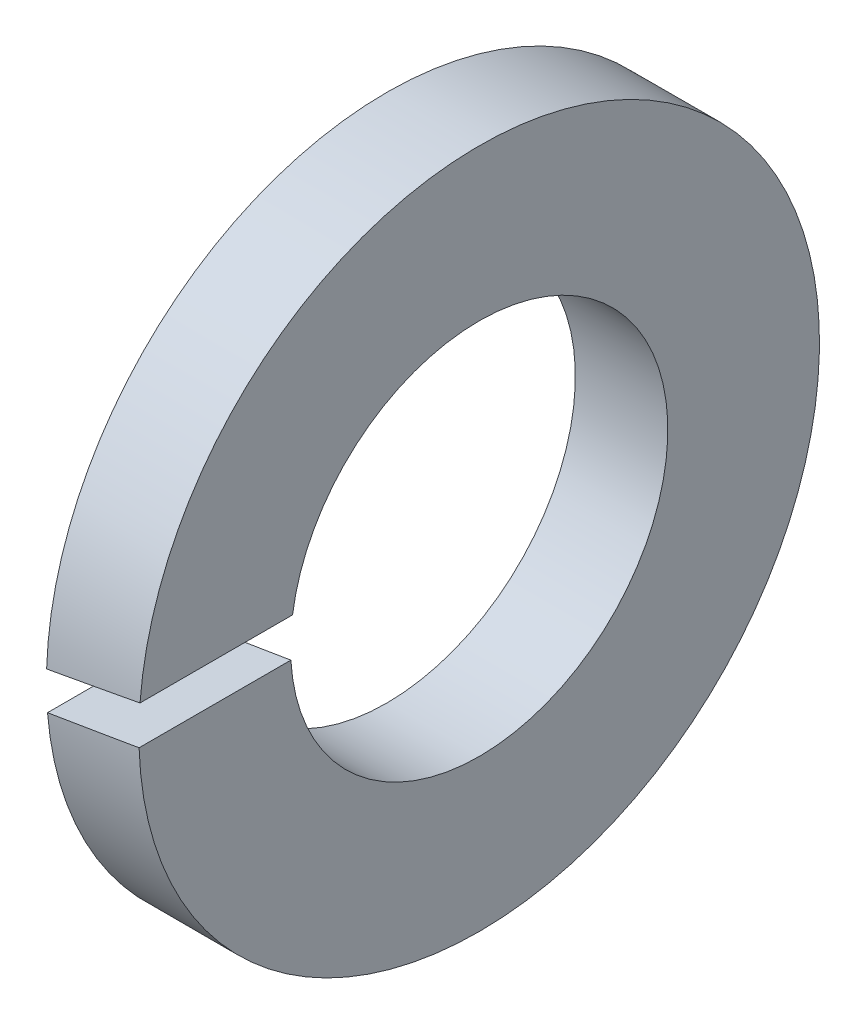
ISO-10303-21;
HEADER;
FILE_DESCRIPTION(('STEP AP214'),'2;1');
FILE_NAME('part.step','',(''),(''),'','','');
FILE_SCHEMA(('AUTOMOTIVE_DESIGN { 1 0 10303 214 1 1 1 1 }'));
ENDSEC;
DATA;
#1=APPLICATION_CONTEXT('core data for automotive mechanical design processes');
#2=APPLICATION_PROTOCOL_DEFINITION('international standard','automotive_design',2000,#1);
#3=PRODUCT_CONTEXT('',#1,'mechanical');
#4=PRODUCT('Part','Part','',(#3));
#5=PRODUCT_RELATED_PRODUCT_CATEGORY('part','',(#4));
#6=PRODUCT_DEFINITION_FORMATION('','',#4);
#7=PRODUCT_DEFINITION_CONTEXT('part definition',#1,'design');
#8=PRODUCT_DEFINITION('design','',#6,#7);
#9=PRODUCT_DEFINITION_SHAPE('','',#8);
#10=(LENGTH_UNIT() NAMED_UNIT(*) SI_UNIT(.MILLI.,.METRE.));
#11=(NAMED_UNIT(*) PLANE_ANGLE_UNIT() SI_UNIT($,.RADIAN.));
#12=(NAMED_UNIT(*) SI_UNIT($,.STERADIAN.) SOLID_ANGLE_UNIT());
#13=UNCERTAINTY_MEASURE_WITH_UNIT(LENGTH_MEASURE(1.E-05),#10,'distance_accuracy_value','');
#14=(GEOMETRIC_REPRESENTATION_CONTEXT(3) GLOBAL_UNCERTAINTY_ASSIGNED_CONTEXT((#13)) GLOBAL_UNIT_ASSIGNED_CONTEXT((#10,
#11,#12)) REPRESENTATION_CONTEXT('',''));
#15=CARTESIAN_POINT('',(0.,0.,0.));
#16=DIRECTION('',(0.,0.,1.));
#17=DIRECTION('',(1.,0.,0.));
#18=AXIS2_PLACEMENT_3D('',#15,#16,#17);
#19=CARTESIAN_POINT('',(-1.25,9.2,0.));
#20=DIRECTION('',(-1.,0.,0.));
#21=DIRECTION('',(0.,0.,1.));
#22=AXIS2_PLACEMENT_3D('',#19,#20,#21);
#23=PLANE('',#22);
#24=CARTESIAN_POINT('',(-1.25,0.,0.));
#25=DIRECTION('',(1.,0.,0.));
#26=DIRECTION('',(0.,0.,-1.));
#27=AXIS2_PLACEMENT_3D('',#24,#25,#26);
#28=CIRCLE('',#27,5.1);
#29=CARTESIAN_POINT('',(-1.25,-0.738276297947311,5.04628062119906));
#30=VERTEX_POINT('',#29);
#31=CARTESIAN_POINT('',(-1.25,0.297458846176149,5.09131792710213));
#32=VERTEX_POINT('',#31);
#33=EDGE_CURVE('E81',#30,#32,#28,.T.);
#34=ORIENTED_EDGE('',*,*,#33,.T.);
#35=DIRECTION('',(0.,0.,1.));
#36=VECTOR('',#35,1.);
#37=CARTESIAN_POINT('',(-1.25,0.297458846176149,0.));
#38=LINE('',#37,#36);
#39=CARTESIAN_POINT('',(-1.25,0.297458846176149,9.1951899509924));
#40=VERTEX_POINT('',#39);
#41=EDGE_CURVE('E100',#32,#40,#38,.T.);
#42=ORIENTED_EDGE('',*,*,#41,.T.);
#43=CARTESIAN_POINT('',(-1.25,0.,0.));
#44=DIRECTION('',(1.,0.,0.));
#45=DIRECTION('',(0.,0.,-1.));
#46=AXIS2_PLACEMENT_3D('',#43,#44,#45);
#47=CIRCLE('',#46,9.2);
#48=CARTESIAN_POINT('',(-1.25,-0.738276297947311,9.17032977094549));
#49=VERTEX_POINT('',#48);
#50=EDGE_CURVE('E92',#49,#40,#47,.T.);
#51=ORIENTED_EDGE('',*,*,#50,.F.);
#52=DIRECTION('',(0.,0.,-1.));
#53=VECTOR('',#52,1.);
#54=CARTESIAN_POINT('',(-1.25,-0.738276297947312,0.));
#55=LINE('',#54,#53);
#56=EDGE_CURVE('E58',#49,#30,#55,.T.);
#57=ORIENTED_EDGE('',*,*,#56,.T.);
#58=EDGE_LOOP('',(#34,#42,#51,#57));
#59=FACE_BOUND('',#58,.T.);
#60=ADVANCED_FACE('F39',(#59),#23,.T.);
#61=CARTESIAN_POINT('',(1.25,0.,0.));
#62=DIRECTION('',(1.,0.,0.));
#63=DIRECTION('',(0.,0.,-1.));
#64=AXIS2_PLACEMENT_3D('',#61,#62,#63);
#65=CYLINDRICAL_SURFACE('',#64,5.1);
#66=CARTESIAN_POINT('',(1.25,0.,0.));
#67=DIRECTION('',(1.,0.,0.));
#68=DIRECTION('',(0.,0.,-1.));
#69=AXIS2_PLACEMENT_3D('',#66,#67,#68);
#70=CIRCLE('',#69,5.1);
#71=CARTESIAN_POINT('',(1.25,-0.297458846176149,5.09131792710213));
#72=VERTEX_POINT('',#71);
#73=CARTESIAN_POINT('',(1.25,0.738276297947311,5.04628062119906));
#74=VERTEX_POINT('',#73);
#75=EDGE_CURVE('E89',#72,#74,#70,.T.);
#76=ORIENTED_EDGE('',*,*,#75,.T.);
#77=CARTESIAN_POINT('',(-2.93697294640325,0.,0.));
#78=DIRECTION('',(0.17364817766693,-0.984807753012208,0.));
#79=DIRECTION('',(0.984807753012208,0.17364817766693,0.));
#80=AXIS2_PLACEMENT_3D('',#77,#78,#79);
#81=ELLIPSE('',#80,29.3697294640325,5.1);
#82=EDGE_CURVE('E110',#74,#32,#81,.T.);
#83=ORIENTED_EDGE('',*,*,#82,.T.);
#84=ORIENTED_EDGE('',*,*,#33,.F.);
#85=CARTESIAN_POINT('',(2.93697294640326,0.,0.));
#86=DIRECTION('',(-0.17364817766693,0.984807753012208,0.));
#87=DIRECTION('',(0.984807753012208,0.17364817766693,0.));
#88=AXIS2_PLACEMENT_3D('',#85,#86,#87);
#89=ELLIPSE('',#88,29.3697294640325,5.1);
#90=EDGE_CURVE('E91',#30,#72,#89,.T.);
#91=ORIENTED_EDGE('',*,*,#90,.T.);
#92=EDGE_LOOP('',(#76,#83,#84,#91));
#93=FACE_BOUND('',#92,.T.);
#94=ADVANCED_FACE('F109',(#93),#65,.F.);
#95=CARTESIAN_POINT('',(1.25,5.1,0.));
#96=DIRECTION('',(1.,0.,0.));
#97=DIRECTION('',(0.,0.,-1.));
#98=AXIS2_PLACEMENT_3D('',#95,#96,#97);
#99=PLANE('',#98);
#100=CARTESIAN_POINT('',(1.25,0.,0.));
#101=DIRECTION('',(1.,0.,0.));
#102=DIRECTION('',(0.,0.,-1.));
#103=AXIS2_PLACEMENT_3D('',#100,#101,#102);
#104=CIRCLE('',#103,9.2);
#105=CARTESIAN_POINT('',(1.25,-0.297458846176149,9.1951899509924));
#106=VERTEX_POINT('',#105);
#107=CARTESIAN_POINT('',(1.25,0.738276297947311,9.17032977094549));
#108=VERTEX_POINT('',#107);
#109=EDGE_CURVE('E88',#106,#108,#104,.T.);
#110=ORIENTED_EDGE('',*,*,#109,.T.);
#111=DIRECTION('',(0.,0.,-1.));
#112=VECTOR('',#111,1.);
#113=CARTESIAN_POINT('',(1.25,0.738276297947311,0.));
#114=LINE('',#113,#112);
#115=EDGE_CURVE('E52',#108,#74,#114,.T.);
#116=ORIENTED_EDGE('',*,*,#115,.T.);
#117=ORIENTED_EDGE('',*,*,#75,.F.);
#118=DIRECTION('',(0.,0.,1.));
#119=VECTOR('',#118,1.);
#120=CARTESIAN_POINT('',(1.25,-0.297458846176149,0.));
#121=LINE('',#120,#119);
#122=EDGE_CURVE('E77',#72,#106,#121,.T.);
#123=ORIENTED_EDGE('',*,*,#122,.T.);
#124=EDGE_LOOP('',(#110,#116,#117,#123));
#125=FACE_BOUND('',#124,.T.);
#126=ADVANCED_FACE('F90',(#125),#99,.T.);
#127=CARTESIAN_POINT('',(1.25,0.,0.));
#128=DIRECTION('',(1.,0.,0.));
#129=DIRECTION('',(0.,0.,-1.));
#130=AXIS2_PLACEMENT_3D('',#127,#128,#129);
#131=CYLINDRICAL_SURFACE('',#130,9.2);
#132=ORIENTED_EDGE('',*,*,#50,.T.);
#133=CARTESIAN_POINT('',(-2.93697294640325,0.,0.));
#134=DIRECTION('',(0.17364817766693,-0.984807753012208,0.));
#135=DIRECTION('',(0.984807753012208,0.17364817766693,0.));
#136=AXIS2_PLACEMENT_3D('',#133,#134,#135);
#137=ELLIPSE('',#136,52.9806884449214,9.2);
#138=EDGE_CURVE('E11',#40,#108,#137,.F.);
#139=ORIENTED_EDGE('',*,*,#138,.T.);
#140=ORIENTED_EDGE('',*,*,#109,.F.);
#141=CARTESIAN_POINT('',(2.93697294640326,0.,0.));
#142=DIRECTION('',(-0.17364817766693,0.984807753012208,0.));
#143=DIRECTION('',(0.984807753012208,0.17364817766693,0.));
#144=AXIS2_PLACEMENT_3D('',#141,#142,#143);
#145=ELLIPSE('',#144,52.9806884449214,9.2);
#146=EDGE_CURVE('E46',#106,#49,#145,.F.);
#147=ORIENTED_EDGE('',*,*,#146,.T.);
#148=EDGE_LOOP('',(#132,#139,#140,#147));
#149=FACE_BOUND('',#148,.T.);
#150=ADVANCED_FACE('F93',(#149),#131,.T.);
#151=CARTESIAN_POINT('',(-2.37345881192039,-0.936372398203552,18.4));
#152=DIRECTION('',(-0.17364817766693,0.984807753012208,0.));
#153=DIRECTION('',(-0.984807753012208,-0.17364817766693,0.));
#154=AXIS2_PLACEMENT_3D('',#151,#152,#153);
#155=PLANE('',#154);
#156=ORIENTED_EDGE('',*,*,#146,.F.);
#157=ORIENTED_EDGE('',*,*,#122,.F.);
#158=ORIENTED_EDGE('',*,*,#90,.F.);
#159=ORIENTED_EDGE('',*,*,#56,.F.);
#160=EDGE_LOOP('',(#156,#157,#158,#159));
#161=FACE_BOUND('',#160,.T.);
#162=ADVANCED_FACE('F78',(#161),#155,.T.);
#163=CARTESIAN_POINT('',(2.37345881192039,0.936372398203552,18.4));
#164=DIRECTION('',(0.17364817766693,-0.984807753012208,0.));
#165=DIRECTION('',(0.984807753012208,0.17364817766693,0.));
#166=AXIS2_PLACEMENT_3D('',#163,#164,#165);
#167=PLANE('',#166);
#168=ORIENTED_EDGE('',*,*,#82,.F.);
#169=ORIENTED_EDGE('',*,*,#115,.F.);
#170=ORIENTED_EDGE('',*,*,#138,.F.);
#171=ORIENTED_EDGE('',*,*,#41,.F.);
#172=EDGE_LOOP('',(#168,#169,#170,#171));
#173=FACE_BOUND('',#172,.T.);
#174=ADVANCED_FACE('F111',(#173),#167,.T.);
#175=CLOSED_SHELL('',(#60,#94,#126,#150,#162,#174));
#176=MANIFOLD_SOLID_BREP('B2',#175);
#177=ADVANCED_BREP_SHAPE_REPRESENTATION('',(#18,#176),#14);
#178=SHAPE_DEFINITION_REPRESENTATION(#9,#177);
ENDSEC;
END-ISO-10303-21;
